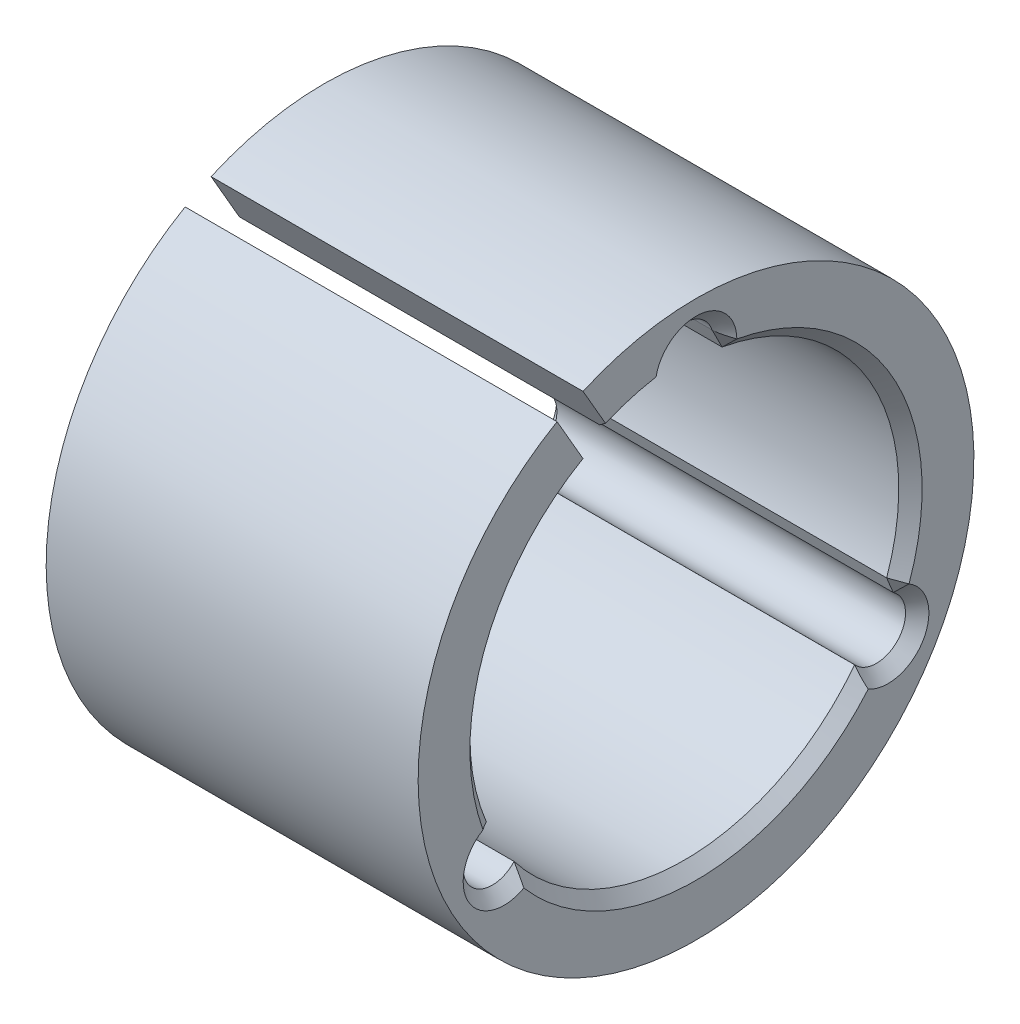
ISO-10303-21;
HEADER;
FILE_DESCRIPTION(('STEP AP214'),'2;1');
FILE_NAME('part.step','',(''),(''),'','','');
FILE_SCHEMA(('AUTOMOTIVE_DESIGN { 1 0 10303 214 1 1 1 1 }'));
ENDSEC;
DATA;
#1=APPLICATION_CONTEXT('core data for automotive mechanical design processes');
#2=APPLICATION_PROTOCOL_DEFINITION('international standard','automotive_design',2000,#1);
#3=PRODUCT_CONTEXT('',#1,'mechanical');
#4=PRODUCT('Part','Part','',(#3));
#5=PRODUCT_RELATED_PRODUCT_CATEGORY('part','',(#4));
#6=PRODUCT_DEFINITION_FORMATION('','',#4);
#7=PRODUCT_DEFINITION_CONTEXT('part definition',#1,'design');
#8=PRODUCT_DEFINITION('design','',#6,#7);
#9=PRODUCT_DEFINITION_SHAPE('','',#8);
#10=(LENGTH_UNIT() NAMED_UNIT(*) SI_UNIT(.MILLI.,.METRE.));
#11=(NAMED_UNIT(*) PLANE_ANGLE_UNIT() SI_UNIT($,.RADIAN.));
#12=(NAMED_UNIT(*) SI_UNIT($,.STERADIAN.) SOLID_ANGLE_UNIT());
#13=UNCERTAINTY_MEASURE_WITH_UNIT(LENGTH_MEASURE(1.E-05),#10,'distance_accuracy_value','');
#14=(GEOMETRIC_REPRESENTATION_CONTEXT(3) GLOBAL_UNCERTAINTY_ASSIGNED_CONTEXT((#13)) GLOBAL_UNIT_ASSIGNED_CONTEXT((#10,
#11,#12)) REPRESENTATION_CONTEXT('',''));
#15=CARTESIAN_POINT('',(0.,0.,0.));
#16=DIRECTION('',(0.,0.,1.));
#17=DIRECTION('',(1.,0.,0.));
#18=AXIS2_PLACEMENT_3D('',#15,#16,#17);
#19=CARTESIAN_POINT('',(12.75,-3.79999999999994,6.58179306876177));
#20=DIRECTION('',(-1.,0.,0.));
#21=DIRECTION('',(0.,0.,1.));
#22=AXIS2_PLACEMENT_3D('',#19,#20,#21);
#23=CYLINDRICAL_SURFACE('',#22,1.);
#24=DIRECTION('',(-1.,0.,0.));
#25=VECTOR('',#24,1.);
#26=CARTESIAN_POINT('',(12.75,-2.82127432049224,6.78696627430335));
#27=LINE('',#26,#25);
#28=CARTESIAN_POINT('',(12.35,-2.82127432049224,6.78696627430335));
#29=VERTEX_POINT('',#28);
#30=CARTESIAN_POINT('',(0.399999999999996,-2.82127432049224,6.78696627430335));
#31=VERTEX_POINT('',#30);
#32=EDGE_CURVE('E255',#29,#31,#27,.T.);
#33=ORIENTED_EDGE('',*,*,#32,.F.);
#34=CARTESIAN_POINT('',(12.35,-3.79999999999994,6.58179306876177));
#35=DIRECTION('',(1.,0.,0.));
#36=DIRECTION('',(0.,0.,-1.));
#37=AXIS2_PLACEMENT_3D('',#34,#35,#36);
#38=CIRCLE('',#37,1.);
#39=CARTESIAN_POINT('',(12.35,-4.46704804792869,5.83677836974272));
#40=VERTEX_POINT('',#39);
#41=EDGE_CURVE('E324',#29,#40,#38,.T.);
#42=ORIENTED_EDGE('',*,*,#41,.T.);
#43=DIRECTION('',(-1.,0.,0.));
#44=VECTOR('',#43,1.);
#45=CARTESIAN_POINT('',(12.75,-4.46704804792869,5.83677836974272));
#46=LINE('',#45,#44);
#47=CARTESIAN_POINT('',(0.399999999999996,-4.46704804792869,5.83677836974272));
#48=VERTEX_POINT('',#47);
#49=EDGE_CURVE('E227',#40,#48,#46,.T.);
#50=ORIENTED_EDGE('',*,*,#49,.T.);
#51=CARTESIAN_POINT('',(0.399999999999996,-3.79999999999994,6.58179306876177));
#52=DIRECTION('',(1.,0.,0.));
#53=DIRECTION('',(0.,0.,-1.));
#54=AXIS2_PLACEMENT_3D('',#51,#52,#53);
#55=CIRCLE('',#54,1.);
#56=EDGE_CURVE('E325',#48,#31,#55,.F.);
#57=ORIENTED_EDGE('',*,*,#56,.T.);
#58=EDGE_LOOP('',(#33,#42,#50,#57));
#59=FACE_BOUND('',#58,.T.);
#60=ADVANCED_FACE('F47',(#59),#23,.F.);
#61=CARTESIAN_POINT('',(12.75,0.,0.));
#62=DIRECTION('',(-1.,0.,0.));
#63=DIRECTION('',(0.,0.,1.));
#64=AXIS2_PLACEMENT_3D('',#61,#62,#63);
#65=CYLINDRICAL_SURFACE('',#64,7.35);
#66=DIRECTION('',(-1.,0.,0.));
#67=VECTOR('',#66,1.);
#68=CARTESIAN_POINT('',(12.75,6.36528671781562,3.67500000000001));
#69=LINE('',#68,#67);
#70=CARTESIAN_POINT('',(12.35,6.36528671781562,3.67500000000001));
#71=VERTEX_POINT('',#70);
#72=CARTESIAN_POINT('',(0.399999999999996,6.36528671781562,3.67500000000001));
#73=VERTEX_POINT('',#72);
#74=EDGE_CURVE('E203',#71,#73,#69,.T.);
#75=ORIENTED_EDGE('',*,*,#74,.F.);
#76=CARTESIAN_POINT('',(12.35,0.,0.));
#77=DIRECTION('',(1.,0.,0.));
#78=DIRECTION('',(0.,0.,-1.));
#79=AXIS2_PLACEMENT_3D('',#76,#77,#78);
#80=CIRCLE('',#79,7.35);
#81=EDGE_CURVE('E291',#71,#29,#80,.T.);
#82=ORIENTED_EDGE('',*,*,#81,.T.);
#83=ORIENTED_EDGE('',*,*,#32,.T.);
#84=CARTESIAN_POINT('',(0.399999999999996,0.,0.));
#85=DIRECTION('',(1.,0.,0.));
#86=DIRECTION('',(0.,0.,-1.));
#87=AXIS2_PLACEMENT_3D('',#84,#85,#86);
#88=CIRCLE('',#87,7.35);
#89=EDGE_CURVE('E288',#31,#73,#88,.F.);
#90=ORIENTED_EDGE('',*,*,#89,.T.);
#91=EDGE_LOOP('',(#75,#82,#83,#90));
#92=FACE_BOUND('',#91,.T.);
#93=ADVANCED_FACE('F555',(#92),#65,.F.);
#94=CARTESIAN_POINT('',(12.75,0.,0.));
#95=DIRECTION('',(0.,0.500000000000001,-0.866025403784438));
#96=DIRECTION('',(0.,0.866025403784438,0.500000000000001));
#97=AXIS2_PLACEMENT_3D('',#94,#95,#96);
#98=PLANE('',#97);
#99=DIRECTION('',(0.,-0.866025403784438,-0.500000000000001));
#100=VECTOR('',#99,1.);
#101=CARTESIAN_POINT('',(12.75,0.,0.));
#102=LINE('',#101,#100);
#103=CARTESIAN_POINT('',(12.75,8.24889197104677,4.76250000000001));
#104=VERTEX_POINT('',#103);
#105=CARTESIAN_POINT('',(12.75,6.71169687932939,3.87500000000001));
#106=VERTEX_POINT('',#105);
#107=EDGE_CURVE('E191',#104,#106,#102,.T.);
#108=ORIENTED_EDGE('',*,*,#107,.T.);
#109=DIRECTION('',(0.707106781186546,0.612372435695796,0.353553390593275));
#110=VECTOR('',#109,1.);
#111=CARTESIAN_POINT('',(5.00000000000004,0.,0.));
#112=LINE('',#111,#110);
#113=EDGE_CURVE('E317',#106,#71,#112,.F.);
#114=ORIENTED_EDGE('',*,*,#113,.T.);
#115=ORIENTED_EDGE('',*,*,#74,.T.);
#116=DIRECTION('',(0.70710678118655,-0.612372435695792,-0.353553390593273));
#117=VECTOR('',#116,1.);
#118=CARTESIAN_POINT('',(7.75000000000004,0.,0.));
#119=LINE('',#118,#117);
#120=CARTESIAN_POINT('',(0.,6.71169687932939,3.87500000000001));
#121=VERTEX_POINT('',#120);
#122=EDGE_CURVE('E316',#73,#121,#119,.F.);
#123=ORIENTED_EDGE('',*,*,#122,.T.);
#124=DIRECTION('',(0.,-0.866025403784438,-0.500000000000001));
#125=VECTOR('',#124,1.);
#126=CARTESIAN_POINT('',(0.,0.,0.));
#127=LINE('',#126,#125);
#128=CARTESIAN_POINT('',(0.,8.24889197104677,4.76250000000001));
#129=VERTEX_POINT('',#128);
#130=EDGE_CURVE('E198',#129,#121,#127,.T.);
#131=ORIENTED_EDGE('',*,*,#130,.F.);
#132=DIRECTION('',(-1.,0.,0.));
#133=VECTOR('',#132,1.);
#134=CARTESIAN_POINT('',(12.75,8.24889197104677,4.76250000000001));
#135=LINE('',#134,#133);
#136=EDGE_CURVE('E186',#104,#129,#135,.T.);
#137=ORIENTED_EDGE('',*,*,#136,.F.);
#138=EDGE_LOOP('',(#108,#114,#115,#123,#131,#137));
#139=FACE_BOUND('',#138,.T.);
#140=ADVANCED_FACE('F194',(#139),#98,.T.);
#141=CARTESIAN_POINT('',(12.75,0.,0.));
#142=DIRECTION('',(-1.,0.,0.));
#143=DIRECTION('',(0.,0.,1.));
#144=AXIS2_PLACEMENT_3D('',#141,#142,#143);
#145=CYLINDRICAL_SURFACE('',#144,9.525);
#146=CARTESIAN_POINT('',(0.,0.,0.));
#147=DIRECTION('',(1.,0.,0.));
#148=DIRECTION('',(0.,0.,-1.));
#149=AXIS2_PLACEMENT_3D('',#146,#147,#148);
#150=CIRCLE('',#149,9.525);
#151=CARTESIAN_POINT('',(0.,8.70274195443803,3.87142189311165));
#152=VERTEX_POINT('',#151);
#153=EDGE_CURVE('E229',#129,#152,#150,.T.);
#154=ORIENTED_EDGE('',*,*,#153,.T.);
#155=DIRECTION('',(-1.,0.,0.));
#156=VECTOR('',#155,1.);
#157=CARTESIAN_POINT('',(12.75,8.70274195443803,3.87142189311165));
#158=LINE('',#157,#156);
#159=CARTESIAN_POINT('',(12.75,8.70274195443803,3.87142189311165));
#160=VERTEX_POINT('',#159);
#161=EDGE_CURVE('E205',#160,#152,#158,.T.);
#162=ORIENTED_EDGE('',*,*,#161,.F.);
#163=CARTESIAN_POINT('',(12.75,0.,0.));
#164=DIRECTION('',(1.,0.,0.));
#165=DIRECTION('',(0.,0.,-1.));
#166=AXIS2_PLACEMENT_3D('',#163,#164,#165);
#167=CIRCLE('',#166,9.525);
#168=EDGE_CURVE('E206',#104,#160,#167,.T.);
#169=ORIENTED_EDGE('',*,*,#168,.F.);
#170=ORIENTED_EDGE('',*,*,#136,.T.);
#171=EDGE_LOOP('',(#154,#162,#169,#170));
#172=FACE_BOUND('',#171,.T.);
#173=ADVANCED_FACE('F210',(#172),#145,.T.);
#174=CARTESIAN_POINT('',(12.75,0.499310634508551,-0.864831387728262));
#175=DIRECTION('',(0.,-0.500000000000001,0.866025403784438));
#176=DIRECTION('',(0.,-0.866025403784438,-0.500000000000001));
#177=AXIS2_PLACEMENT_3D('',#174,#175,#176);
#178=PLANE('',#177);
#179=DIRECTION('',(-1.,0.,0.));
#180=VECTOR('',#179,1.);
#181=CARTESIAN_POINT('',(12.75,7.0240379599069,2.9022216899794));
#182=LINE('',#181,#180);
#183=CARTESIAN_POINT('',(12.35,7.0240379599069,2.9022216899794));
#184=VERTEX_POINT('',#183);
#185=CARTESIAN_POINT('',(0.,7.0240379599069,2.9022216899794));
#186=VERTEX_POINT('',#185);
#187=EDGE_CURVE('E247',#184,#186,#182,.T.);
#188=ORIENTED_EDGE('',*,*,#187,.F.);
#189=CARTESIAN_POINT('',(12.35,7.0240379599069,2.9022216899794));
#190=CARTESIAN_POINT('',(12.4166522960563,7.08226472669563,2.93583892945891));
#191=CARTESIAN_POINT('',(12.4833117774276,7.14048532206287,2.96945260586656));
#192=CARTESIAN_POINT('',(12.616645110761,7.25691416992027,3.03667283251847));
#193=CARTESIAN_POINT('',(12.683318962723,7.31512242241044,3.07027938276273));
#194=CARTESIAN_POINT('',(12.75,7.37332450347913,3.10388236993514));
#195=B_SPLINE_CURVE_WITH_KNOTS('',3,(#189,#190,#191,#192,#193,#194),.UNSPECIFIED.,.F.,.F.,(4,2,
4),(0.,0.284019419774727,0.568038839383033),.UNSPECIFIED.);
#196=CARTESIAN_POINT('',(12.75,7.37332450347913,3.10388236993514));
#197=VERTEX_POINT('',#196);
#198=EDGE_CURVE('E613',#184,#197,#195,.T.);
#199=ORIENTED_EDGE('',*,*,#198,.T.);
#200=DIRECTION('',(0.,0.866025403784438,0.500000000000001));
#201=VECTOR('',#200,1.);
#202=CARTESIAN_POINT('',(12.75,0.499310634508551,-0.864831387728262));
#203=LINE('',#202,#201);
#204=EDGE_CURVE('E211',#197,#160,#203,.T.);
#205=ORIENTED_EDGE('',*,*,#204,.T.);
#206=ORIENTED_EDGE('',*,*,#161,.T.);
#207=DIRECTION('',(0.,0.866025403784438,0.500000000000001));
#208=VECTOR('',#207,1.);
#209=CARTESIAN_POINT('',(0.,0.499310634508551,-0.864831387728262));
#210=LINE('',#209,#208);
#211=EDGE_CURVE('E222',#186,#152,#210,.T.);
#212=ORIENTED_EDGE('',*,*,#211,.F.);
#213=EDGE_LOOP('',(#188,#199,#205,#206,#212));
#214=FACE_BOUND('',#213,.T.);
#215=ADVANCED_FACE('F616',(#214),#178,.T.);
#216=CARTESIAN_POINT('',(12.75,0.,0.));
#217=DIRECTION('',(-1.,0.,0.));
#218=DIRECTION('',(0.,0.,1.));
#219=AXIS2_PLACEMENT_3D('',#216,#217,#218);
#220=CYLINDRICAL_SURFACE('',#219,7.6);
#221=DIRECTION('',(-1.,0.,0.));
#222=VECTOR('',#221,1.);
#223=CARTESIAN_POINT('',(12.75,7.53421052631579,0.997833525770888));
#224=LINE('',#223,#222);
#225=CARTESIAN_POINT('',(12.35,7.53421052631579,0.997833525770888));
#226=VERTEX_POINT('',#225);
#227=CARTESIAN_POINT('',(0.399999999999996,7.53421052631579,0.997833525770888));
#228=VERTEX_POINT('',#227);
#229=EDGE_CURVE('E245',#226,#228,#224,.T.);
#230=ORIENTED_EDGE('',*,*,#229,.F.);
#231=CARTESIAN_POINT('',(12.35,0.,0.));
#232=DIRECTION('',(1.,0.,0.));
#233=DIRECTION('',(0.,0.,-1.));
#234=AXIS2_PLACEMENT_3D('',#231,#232,#233);
#235=CIRCLE('',#234,7.6);
#236=EDGE_CURVE('E345',#226,#184,#235,.T.);
#237=ORIENTED_EDGE('',*,*,#236,.T.);
#238=ORIENTED_EDGE('',*,*,#187,.T.);
#239=CARTESIAN_POINT('',(0.,0.,0.));
#240=DIRECTION('',(1.,0.,0.));
#241=DIRECTION('',(0.,0.,-1.));
#242=AXIS2_PLACEMENT_3D('',#239,#240,#241);
#243=CIRCLE('',#242,7.6);
#244=CARTESIAN_POINT('',(0.,7.47105263157895,1.39404898629039));
#245=VERTEX_POINT('',#244);
#246=EDGE_CURVE('E220',#245,#186,#243,.T.);
#247=ORIENTED_EDGE('',*,*,#246,.F.);
#248=CARTESIAN_POINT('',(0.,7.47105263157895,1.39404898629039));
#249=CARTESIAN_POINT('',(0.0666317121295569,7.48332781409374,1.32825656081401));
#250=CARTESIAN_POINT('',(0.133280901875942,7.4947285632917,1.26234239268646));
#251=CARTESIAN_POINT('',(0.266614235210004,7.51578119483412,1.1302705725082));
#252=CARTESIAN_POINT('',(0.333298378796951,7.52543307721511,1.06411292046259));
#253=CARTESIAN_POINT('',(0.399999999999996,7.53421052631579,0.997833525770885));
#254=B_SPLINE_CURVE_WITH_KNOTS('',3,(#248,#249,#250,#251,#252,#253),.UNSPECIFIED.,.F.,.F.,(4,2,
4),(0.,0.283285937216528,0.56657186851649),.UNSPECIFIED.);
#255=EDGE_CURVE('E331',#245,#228,#254,.T.);
#256=ORIENTED_EDGE('',*,*,#255,.T.);
#257=EDGE_LOOP('',(#230,#237,#238,#247,#256));
#258=FACE_BOUND('',#257,.T.);
#259=ADVANCED_FACE('F343',(#258),#220,.F.);
#260=CARTESIAN_POINT('',(12.75,7.6,0.));
#261=DIRECTION('',(-1.,0.,0.));
#262=DIRECTION('',(0.,0.,1.));
#263=AXIS2_PLACEMENT_3D('',#260,#261,#262);
#264=CYLINDRICAL_SURFACE('',#263,1.);
#265=DIRECTION('',(-1.,0.,0.));
#266=VECTOR('',#265,1.);
#267=CARTESIAN_POINT('',(12.75,7.92077063747412,-0.947156902595578));
#268=LINE('',#267,#266);
#269=CARTESIAN_POINT('',(0.399999999999996,7.92077063747412,-0.947156902595577));
#270=VERTEX_POINT('',#269);
#271=CARTESIAN_POINT('',(12.35,7.92077063747412,-0.947156902595577));
#272=VERTEX_POINT('',#271);
#273=EDGE_CURVE('E273',#270,#272,#268,.F.);
#274=ORIENTED_EDGE('',*,*,#273,.T.);
#275=CARTESIAN_POINT('',(12.35,7.6,0.));
#276=DIRECTION('',(1.,0.,0.));
#277=DIRECTION('',(0.,0.,-1.));
#278=AXIS2_PLACEMENT_3D('',#275,#276,#277);
#279=CIRCLE('',#278,1.);
#280=EDGE_CURVE('E279',#272,#226,#279,.T.);
#281=ORIENTED_EDGE('',*,*,#280,.T.);
#282=ORIENTED_EDGE('',*,*,#229,.T.);
#283=CARTESIAN_POINT('',(0.399999999999996,7.6,0.));
#284=DIRECTION('',(1.,0.,0.));
#285=DIRECTION('',(0.,0.,-1.));
#286=AXIS2_PLACEMENT_3D('',#283,#284,#285);
#287=CIRCLE('',#286,1.);
#288=EDGE_CURVE('E271',#228,#270,#287,.F.);
#289=ORIENTED_EDGE('',*,*,#288,.T.);
#290=EDGE_LOOP('',(#274,#281,#282,#289));
#291=FACE_BOUND('',#290,.T.);
#292=ADVANCED_FACE('F591',(#291),#264,.F.);
#293=CARTESIAN_POINT('',(12.75,0.,0.));
#294=DIRECTION('',(-1.,0.,0.));
#295=DIRECTION('',(0.,0.,1.));
#296=AXIS2_PLACEMENT_3D('',#293,#294,#295);
#297=CYLINDRICAL_SURFACE('',#296,7.35);
#298=DIRECTION('',(-1.,0.,0.));
#299=VECTOR('',#298,1.);
#300=CARTESIAN_POINT('',(12.75,-2.43684319827992,-6.93428404573946));
#301=LINE('',#300,#299);
#302=CARTESIAN_POINT('',(0.399999999999996,-2.43684319827992,-6.93428404573947));
#303=VERTEX_POINT('',#302);
#304=CARTESIAN_POINT('',(12.35,-2.43684319827992,-6.93428404573947));
#305=VERTEX_POINT('',#304);
#306=EDGE_CURVE('E261',#303,#305,#301,.F.);
#307=ORIENTED_EDGE('',*,*,#306,.T.);
#308=CARTESIAN_POINT('',(12.35,0.,0.));
#309=DIRECTION('',(1.,0.,0.));
#310=DIRECTION('',(0.,0.,-1.));
#311=AXIS2_PLACEMENT_3D('',#308,#309,#310);
#312=CIRCLE('',#311,7.35);
#313=CARTESIAN_POINT('',(12.35,7.23518420095203,-1.2940670687001));
#314=VERTEX_POINT('',#313);
#315=EDGE_CURVE('E268',#305,#314,#312,.T.);
#316=ORIENTED_EDGE('',*,*,#315,.T.);
#317=DIRECTION('',(-1.,0.,0.));
#318=VECTOR('',#317,1.);
#319=CARTESIAN_POINT('',(12.75,7.23518420095203,-1.2940670687001));
#320=LINE('',#319,#318);
#321=CARTESIAN_POINT('',(0.399999999999996,7.23518420095203,-1.2940670687001));
#322=VERTEX_POINT('',#321);
#323=EDGE_CURVE('E262',#314,#322,#320,.T.);
#324=ORIENTED_EDGE('',*,*,#323,.T.);
#325=CARTESIAN_POINT('',(0.399999999999996,0.,0.));
#326=DIRECTION('',(1.,0.,0.));
#327=DIRECTION('',(0.,0.,-1.));
#328=AXIS2_PLACEMENT_3D('',#325,#326,#327);
#329=CIRCLE('',#328,7.35);
#330=EDGE_CURVE('E256',#322,#303,#329,.F.);
#331=ORIENTED_EDGE('',*,*,#330,.T.);
#332=EDGE_LOOP('',(#307,#316,#324,#331));
#333=FACE_BOUND('',#332,.T.);
#334=ADVANCED_FACE('F647',(#333),#297,.F.);
#335=CARTESIAN_POINT('',(12.75,-3.80000000000003,-6.58179306876172));
#336=DIRECTION('',(-1.,0.,0.));
#337=DIRECTION('',(0.,0.,1.));
#338=AXIS2_PLACEMENT_3D('',#335,#336,#337);
#339=CYLINDRICAL_SURFACE('',#338,1.);
#340=DIRECTION('',(-1.,0.,0.));
#341=VECTOR('',#340,1.);
#342=CARTESIAN_POINT('',(12.75,-4.46704804792877,-5.83677836974266));
#343=LINE('',#342,#341);
#344=CARTESIAN_POINT('',(12.35,-4.46704804792877,-5.83677836974266));
#345=VERTEX_POINT('',#344);
#346=CARTESIAN_POINT('',(0.399999999999996,-4.46704804792877,-5.83677836974266));
#347=VERTEX_POINT('',#346);
#348=EDGE_CURVE('E236',#345,#347,#343,.T.);
#349=ORIENTED_EDGE('',*,*,#348,.F.);
#350=CARTESIAN_POINT('',(12.35,-3.80000000000003,-6.58179306876172));
#351=DIRECTION('',(1.,0.,0.));
#352=DIRECTION('',(0.,0.,-1.));
#353=AXIS2_PLACEMENT_3D('',#350,#351,#352);
#354=CIRCLE('',#353,1.);
#355=CARTESIAN_POINT('',(12.35,-2.98427231044547,-7.16022918147771));
#356=VERTEX_POINT('',#355);
#357=EDGE_CURVE('E289',#345,#356,#354,.T.);
#358=ORIENTED_EDGE('',*,*,#357,.T.);
#359=DIRECTION('',(-1.,0.,0.));
#360=VECTOR('',#359,1.);
#361=CARTESIAN_POINT('',(12.75,-2.98427231044547,-7.16022918147771));
#362=LINE('',#361,#360);
#363=CARTESIAN_POINT('',(0.399999999999996,-2.98427231044547,-7.16022918147771));
#364=VERTEX_POINT('',#363);
#365=EDGE_CURVE('E284',#356,#364,#362,.T.);
#366=ORIENTED_EDGE('',*,*,#365,.T.);
#367=CARTESIAN_POINT('',(0.399999999999996,-3.80000000000003,-6.58179306876172));
#368=DIRECTION('',(1.,0.,0.));
#369=DIRECTION('',(0.,0.,-1.));
#370=AXIS2_PLACEMENT_3D('',#367,#368,#369);
#371=CIRCLE('',#370,1.);
#372=EDGE_CURVE('E282',#364,#347,#371,.F.);
#373=ORIENTED_EDGE('',*,*,#372,.T.);
#374=EDGE_LOOP('',(#349,#358,#366,#373));
#375=FACE_BOUND('',#374,.T.);
#376=ADVANCED_FACE('F656',(#375),#339,.F.);
#377=CARTESIAN_POINT('',(12.75,0.,0.));
#378=DIRECTION('',(-1.,0.,0.));
#379=DIRECTION('',(0.,0.,1.));
#380=AXIS2_PLACEMENT_3D('',#377,#378,#379);
#381=CYLINDRICAL_SURFACE('',#380,7.35);
#382=ORIENTED_EDGE('',*,*,#49,.F.);
#383=CARTESIAN_POINT('',(12.35,0.,0.));
#384=DIRECTION('',(1.,0.,0.));
#385=DIRECTION('',(0.,0.,-1.));
#386=AXIS2_PLACEMENT_3D('',#383,#384,#385);
#387=CIRCLE('',#386,7.35);
#388=EDGE_CURVE('E332',#40,#345,#387,.T.);
#389=ORIENTED_EDGE('',*,*,#388,.T.);
#390=ORIENTED_EDGE('',*,*,#348,.T.);
#391=CARTESIAN_POINT('',(0.399999999999996,0.,0.));
#392=DIRECTION('',(1.,0.,0.));
#393=DIRECTION('',(0.,0.,-1.));
#394=AXIS2_PLACEMENT_3D('',#391,#392,#393);
#395=CIRCLE('',#394,7.35);
#396=EDGE_CURVE('E327',#347,#48,#395,.F.);
#397=ORIENTED_EDGE('',*,*,#396,.T.);
#398=EDGE_LOOP('',(#382,#389,#390,#397));
#399=FACE_BOUND('',#398,.T.);
#400=ADVANCED_FACE('F663',(#399),#381,.F.);
#401=CARTESIAN_POINT('',(12.75,0.,0.));
#402=DIRECTION('',(1.,0.,0.));
#403=DIRECTION('',(0.,0.,-1.));
#404=AXIS2_PLACEMENT_3D('',#401,#402,#403);
#405=PLANE('',#404);
#406=CARTESIAN_POINT('',(12.75,-3.79999999999994,6.58179306876177));
#407=DIRECTION('',(1.,0.,0.));
#408=DIRECTION('',(0.,0.,-1.));
#409=AXIS2_PLACEMENT_3D('',#406,#407,#408);
#410=CIRCLE('',#409,1.4);
#411=CARTESIAN_POINT('',(12.75,-5.02354496383687,5.90139780020879));
#412=VERTEX_POINT('',#411);
#413=CARTESIAN_POINT('',(12.75,-2.59898793089985,7.30121645584055));
#414=VERTEX_POINT('',#413);
#415=EDGE_CURVE('E313',#412,#414,#410,.F.);
#416=ORIENTED_EDGE('',*,*,#415,.T.);
#417=CARTESIAN_POINT('',(12.75,0.,0.));
#418=DIRECTION('',(1.,0.,0.));
#419=DIRECTION('',(0.,0.,-1.));
#420=AXIS2_PLACEMENT_3D('',#417,#418,#419);
#421=CIRCLE('',#420,7.75);
#422=EDGE_CURVE('E214',#414,#106,#421,.F.);
#423=ORIENTED_EDGE('',*,*,#422,.T.);
#424=ORIENTED_EDGE('',*,*,#107,.F.);
#425=ORIENTED_EDGE('',*,*,#168,.T.);
#426=ORIENTED_EDGE('',*,*,#204,.F.);
#427=CARTESIAN_POINT('',(12.75,0.,0.));
#428=DIRECTION('',(1.,0.,0.));
#429=DIRECTION('',(0.,0.,-1.));
#430=AXIS2_PLACEMENT_3D('',#427,#428,#429);
#431=CIRCLE('',#430,7.99999999999999);
#432=CARTESIAN_POINT('',(12.75,7.88157894736842,1.37139100784528));
#433=VERTEX_POINT('',#432);
#434=EDGE_CURVE('E297',#197,#433,#431,.F.);
#435=ORIENTED_EDGE('',*,*,#434,.T.);
#436=CARTESIAN_POINT('',(12.75,7.6,0.));
#437=DIRECTION('',(1.,0.,0.));
#438=DIRECTION('',(0.,0.,-1.));
#439=AXIS2_PLACEMENT_3D('',#436,#437,#438);
#440=CIRCLE('',#439,1.4);
#441=CARTESIAN_POINT('',(12.75,7.62253289473684,-1.39981865563178));
#442=VERTEX_POINT('',#441);
#443=EDGE_CURVE('E299',#433,#442,#440,.F.);
#444=ORIENTED_EDGE('',*,*,#443,.T.);
#445=CARTESIAN_POINT('',(12.75,0.,0.));
#446=DIRECTION('',(1.,0.,0.));
#447=DIRECTION('',(0.,0.,-1.));
#448=AXIS2_PLACEMENT_3D('',#445,#446,#447);
#449=CIRCLE('',#448,7.75);
#450=CARTESIAN_POINT('',(12.75,-2.59898793089995,-7.30121645584051));
#451=VERTEX_POINT('',#450);
#452=EDGE_CURVE('E304',#442,#451,#449,.F.);
#453=ORIENTED_EDGE('',*,*,#452,.T.);
#454=CARTESIAN_POINT('',(12.75,-3.80000000000003,-6.58179306876172));
#455=DIRECTION('',(1.,0.,0.));
#456=DIRECTION('',(0.,0.,-1.));
#457=AXIS2_PLACEMENT_3D('',#454,#455,#456);
#458=CIRCLE('',#457,1.4);
#459=CARTESIAN_POINT('',(12.75,-5.02354496383695,-5.90139780020872));
#460=VERTEX_POINT('',#459);
#461=EDGE_CURVE('E303',#451,#460,#458,.F.);
#462=ORIENTED_EDGE('',*,*,#461,.T.);
#463=CARTESIAN_POINT('',(12.75,0.,0.));
#464=DIRECTION('',(1.,0.,0.));
#465=DIRECTION('',(0.,0.,-1.));
#466=AXIS2_PLACEMENT_3D('',#463,#464,#465);
#467=CIRCLE('',#466,7.75);
#468=EDGE_CURVE('E306',#460,#412,#467,.F.);
#469=ORIENTED_EDGE('',*,*,#468,.T.);
#470=EDGE_LOOP('',(#416,#423,#424,#425,#426,#435,#444,#453,#462,#469));
#471=FACE_BOUND('',#470,.T.);
#472=ADVANCED_FACE('F213',(#471),#405,.T.);
#473=CARTESIAN_POINT('',(0.,0.,0.));
#474=DIRECTION('',(1.,0.,0.));
#475=DIRECTION('',(0.,0.,-1.));
#476=AXIS2_PLACEMENT_3D('',#473,#474,#475);
#477=PLANE('',#476);
#478=ORIENTED_EDGE('',*,*,#130,.T.);
#479=CARTESIAN_POINT('',(0.,0.,0.));
#480=DIRECTION('',(1.,0.,0.));
#481=DIRECTION('',(0.,0.,-1.));
#482=AXIS2_PLACEMENT_3D('',#479,#480,#481);
#483=CIRCLE('',#482,7.74999999999999);
#484=CARTESIAN_POINT('',(0.,-2.59898793089985,7.30121645584055));
#485=VERTEX_POINT('',#484);
#486=EDGE_CURVE('E11',#121,#485,#483,.T.);
#487=ORIENTED_EDGE('',*,*,#486,.T.);
#488=CARTESIAN_POINT('',(0.,-3.79999999999994,6.58179306876177));
#489=DIRECTION('',(1.,0.,0.));
#490=DIRECTION('',(0.,0.,-1.));
#491=AXIS2_PLACEMENT_3D('',#488,#489,#490);
#492=CIRCLE('',#491,1.39999999999999);
#493=CARTESIAN_POINT('',(0.,-5.02354496383686,5.90139780020879));
#494=VERTEX_POINT('',#493);
#495=EDGE_CURVE('E67',#485,#494,#492,.T.);
#496=ORIENTED_EDGE('',*,*,#495,.T.);
#497=CARTESIAN_POINT('',(0.,0.,0.));
#498=DIRECTION('',(1.,0.,0.));
#499=DIRECTION('',(0.,0.,-1.));
#500=AXIS2_PLACEMENT_3D('',#497,#498,#499);
#501=CIRCLE('',#500,7.74999999999999);
#502=CARTESIAN_POINT('',(0.,-5.02354496383695,-5.90139780020872));
#503=VERTEX_POINT('',#502);
#504=EDGE_CURVE('E602',#494,#503,#501,.T.);
#505=ORIENTED_EDGE('',*,*,#504,.T.);
#506=CARTESIAN_POINT('',(0.,-3.80000000000003,-6.58179306876172));
#507=DIRECTION('',(1.,0.,0.));
#508=DIRECTION('',(0.,0.,-1.));
#509=AXIS2_PLACEMENT_3D('',#506,#507,#508);
#510=CIRCLE('',#509,1.39999999999999);
#511=CARTESIAN_POINT('',(0.,-2.59898793089995,-7.30121645584051));
#512=VERTEX_POINT('',#511);
#513=EDGE_CURVE('E607',#503,#512,#510,.T.);
#514=ORIENTED_EDGE('',*,*,#513,.T.);
#515=CARTESIAN_POINT('',(0.,0.,0.));
#516=DIRECTION('',(1.,0.,0.));
#517=DIRECTION('',(0.,0.,-1.));
#518=AXIS2_PLACEMENT_3D('',#515,#516,#517);
#519=CIRCLE('',#518,7.74999999999999);
#520=CARTESIAN_POINT('',(0.,7.62253289473684,-1.39981865563178));
#521=VERTEX_POINT('',#520);
#522=EDGE_CURVE('E606',#512,#521,#519,.T.);
#523=ORIENTED_EDGE('',*,*,#522,.T.);
#524=CARTESIAN_POINT('',(0.,7.6,0.));
#525=DIRECTION('',(1.,0.,0.));
#526=DIRECTION('',(0.,0.,-1.));
#527=AXIS2_PLACEMENT_3D('',#524,#525,#526);
#528=CIRCLE('',#527,1.39999999999999);
#529=EDGE_CURVE('E596',#521,#245,#528,.T.);
#530=ORIENTED_EDGE('',*,*,#529,.T.);
#531=ORIENTED_EDGE('',*,*,#246,.T.);
#532=ORIENTED_EDGE('',*,*,#211,.T.);
#533=ORIENTED_EDGE('',*,*,#153,.F.);
#534=EDGE_LOOP('',(#478,#487,#496,#505,#514,#523,#530,#531,#532,#533));
#535=FACE_BOUND('',#534,.T.);
#536=ADVANCED_FACE('F547',(#535),#477,.F.);
#537=CARTESIAN_POINT('',(12.35,0.,0.));
#538=DIRECTION('',(1.,0.,0.));
#539=DIRECTION('',(0.,0.,-1.));
#540=AXIS2_PLACEMENT_3D('',#537,#538,#539);
#541=CONICAL_SURFACE('',#540,7.35,0.78539816339745);
#542=ORIENTED_EDGE('',*,*,#113,.F.);
#543=ORIENTED_EDGE('',*,*,#422,.F.);
#544=CARTESIAN_POINT('',(12.35,-2.82127432049224,6.78696627430335));
#545=CARTESIAN_POINT('',(12.3809277638869,-2.79869735873939,6.82983966038442));
#546=CARTESIAN_POINT('',(12.4126572508062,-2.7773736614635,6.87276296238352));
#547=CARTESIAN_POINT('',(12.4773749432949,-2.73687932510569,6.95858088761474));
#548=CARTESIAN_POINT('',(12.5103614578121,-2.71770592137262,7.00147547552115));
#549=CARTESIAN_POINT('',(12.5773109869629,-2.68111261655947,7.08719437651109));
#550=CARTESIAN_POINT('',(12.6112734208567,-2.66369169931457,7.13001871599001));
#551=CARTESIAN_POINT('',(12.6800522891193,-2.63030572988747,7.21565077573461));
#552=CARTESIAN_POINT('',(12.71486977259,-2.61434259251498,7.25845840263975));
#553=CARTESIAN_POINT('',(12.75,-2.59898793089985,7.30121645584055));
#554=B_SPLINE_CURVE_WITH_KNOTS('',3,(#544,#545,#546,#547,#548,#549,#550,#551,#552,#553),
.UNSPECIFIED.,.F.,.F.,(4,2,2,2,4),(0.,0.172397881871036,0.344571505744794,0.516644713646749,
0.688940784914335),.UNSPECIFIED.);
#555=EDGE_CURVE('E54',#29,#414,#554,.T.);
#556=ORIENTED_EDGE('',*,*,#555,.F.);
#557=ORIENTED_EDGE('',*,*,#81,.F.);
#558=EDGE_LOOP('',(#542,#543,#556,#557));
#559=FACE_BOUND('',#558,.T.);
#560=ADVANCED_FACE('F55',(#559),#541,.F.);
#561=CARTESIAN_POINT('',(0.,0.,0.));
#562=DIRECTION('',(-1.,0.,0.));
#563=DIRECTION('',(0.,0.,1.));
#564=AXIS2_PLACEMENT_3D('',#561,#562,#563);
#565=CONICAL_SURFACE('',#564,7.74999999999999,0.785398163397445);
#566=ORIENTED_EDGE('',*,*,#122,.F.);
#567=ORIENTED_EDGE('',*,*,#89,.F.);
#568=CARTESIAN_POINT('',(0.,-2.59898793089985,7.30121645584055));
#569=CARTESIAN_POINT('',(0.0351302274100157,-2.61434259251498,7.25845840263975));
#570=CARTESIAN_POINT('',(0.0699477108806955,-2.63030572988747,7.21565077573461));
#571=CARTESIAN_POINT('',(0.138726579143276,-2.66369169931457,7.13001871599001));
#572=CARTESIAN_POINT('',(0.17268901303709,-2.68111261655947,7.08719437651109));
#573=CARTESIAN_POINT('',(0.239638542187887,-2.71770592137262,7.00147547552114));
#574=CARTESIAN_POINT('',(0.272625056705122,-2.73687932510569,6.95858088761474));
#575=CARTESIAN_POINT('',(0.337342749193798,-2.7773736614635,6.87276296238352));
#576=CARTESIAN_POINT('',(0.369072236113133,-2.79869735873939,6.82983966038442));
#577=CARTESIAN_POINT('',(0.399999999999994,-2.82127432049225,6.78696627430334));
#578=B_SPLINE_CURVE_WITH_KNOTS('',3,(#568,#569,#570,#571,#572,#573,#574,#575,#576,#577),
.UNSPECIFIED.,.F.,.F.,(4,2,2,2,4),(0.,0.172296071267585,0.344369279169539,0.516542903043299,
0.688940784914333),.UNSPECIFIED.);
#579=EDGE_CURVE('E523',#485,#31,#578,.T.);
#580=ORIENTED_EDGE('',*,*,#579,.F.);
#581=ORIENTED_EDGE('',*,*,#486,.F.);
#582=EDGE_LOOP('',(#566,#567,#580,#581));
#583=FACE_BOUND('',#582,.T.);
#584=ADVANCED_FACE('F540',(#583),#565,.F.);
#585=CARTESIAN_POINT('',(12.35,-3.79999999999994,6.58179306876177));
#586=DIRECTION('',(1.,0.,0.));
#587=DIRECTION('',(0.,0.,-1.));
#588=AXIS2_PLACEMENT_3D('',#585,#586,#587);
#589=CONICAL_SURFACE('',#588,1.,0.78539816339745);
#590=ORIENTED_EDGE('',*,*,#555,.T.);
#591=ORIENTED_EDGE('',*,*,#415,.F.);
#592=CARTESIAN_POINT('',(12.35,-4.46704804792869,5.83677836974272));
#593=CARTESIAN_POINT('',(12.3809277638869,-4.51546597029759,5.83866284036502));
#594=CARTESIAN_POINT('',(12.4126572508062,-4.56330048888107,5.84165762782104));
#595=CARTESIAN_POINT('',(12.4773749432949,-4.65786816041028,5.84949746644139));
#596=CARTESIAN_POINT('',(12.5103614578121,-4.70460266508863,5.85434010568474));
#597=CARTESIAN_POINT('',(12.5773109869629,-4.79713406333698,5.86550882460311));
#598=CARTESIAN_POINT('',(12.6112734208567,-4.84293148784846,5.87183403745125));
#599=CARTESIAN_POINT('',(12.6800522891193,-4.93378401167923,5.88573696966971));
#600=CARTESIAN_POINT('',(12.71486977259,-4.97883807274104,5.89331630063361));
#601=CARTESIAN_POINT('',(12.75,-5.02354496383687,5.90139780020879));
#602=B_SPLINE_CURVE_WITH_KNOTS('',3,(#592,#593,#594,#595,#596,#597,#598,#599,#600,#601),
.UNSPECIFIED.,.F.,.F.,(4,2,2,2,4),(0.,0.172397881871036,0.344571505744795,0.516644713646748,
0.688940784914337),.UNSPECIFIED.);
#603=EDGE_CURVE('E518',#40,#412,#602,.T.);
#604=ORIENTED_EDGE('',*,*,#603,.F.);
#605=ORIENTED_EDGE('',*,*,#41,.F.);
#606=EDGE_LOOP('',(#590,#591,#604,#605));
#607=FACE_BOUND('',#606,.T.);
#608=ADVANCED_FACE('F533',(#607),#589,.F.);
#609=CARTESIAN_POINT('',(0.,-3.79999999999994,6.58179306876177));
#610=DIRECTION('',(-1.,0.,0.));
#611=DIRECTION('',(0.,0.,1.));
#612=AXIS2_PLACEMENT_3D('',#609,#610,#611);
#613=CONICAL_SURFACE('',#612,1.39999999999999,0.785398163397445);
#614=ORIENTED_EDGE('',*,*,#579,.T.);
#615=ORIENTED_EDGE('',*,*,#56,.F.);
#616=CARTESIAN_POINT('',(0.,-5.02354496383686,5.90139780020879));
#617=CARTESIAN_POINT('',(0.035130227410016,-4.97883807274104,5.89331630063361));
#618=CARTESIAN_POINT('',(0.0699477108806958,-4.93378401167922,5.88573696966971));
#619=CARTESIAN_POINT('',(0.138726579143276,-4.84293148784846,5.87183403745125));
#620=CARTESIAN_POINT('',(0.17268901303709,-4.79713406333697,5.8655088246031));
#621=CARTESIAN_POINT('',(0.239638542187887,-4.70460266508862,5.85434010568474));
#622=CARTESIAN_POINT('',(0.272625056705122,-4.65786816041028,5.84949746644139));
#623=CARTESIAN_POINT('',(0.337342749193798,-4.56330048888106,5.84165762782104));
#624=CARTESIAN_POINT('',(0.369072236113133,-4.51546597029759,5.83866284036502));
#625=CARTESIAN_POINT('',(0.399999999999994,-4.46704804792869,5.83677836974272));
#626=B_SPLINE_CURVE_WITH_KNOTS('',3,(#616,#617,#618,#619,#620,#621,#622,#623,#624,#625),
.UNSPECIFIED.,.F.,.F.,(4,2,2,2,4),(0.,0.172296071267584,0.344369279169539,0.516542903043299,
0.688940784914333),.UNSPECIFIED.);
#627=EDGE_CURVE('E496',#494,#48,#626,.T.);
#628=ORIENTED_EDGE('',*,*,#627,.F.);
#629=ORIENTED_EDGE('',*,*,#495,.F.);
#630=EDGE_LOOP('',(#614,#615,#628,#629));
#631=FACE_BOUND('',#630,.T.);
#632=ADVANCED_FACE('F514',(#631),#613,.F.);
#633=CARTESIAN_POINT('',(12.35,0.,0.));
#634=DIRECTION('',(1.,0.,0.));
#635=DIRECTION('',(0.,0.,-1.));
#636=AXIS2_PLACEMENT_3D('',#633,#634,#635);
#637=CONICAL_SURFACE('',#636,7.35,0.78539816339745);
#638=ORIENTED_EDGE('',*,*,#603,.T.);
#639=ORIENTED_EDGE('',*,*,#468,.F.);
#640=CARTESIAN_POINT('',(12.35,-4.46704804792877,-5.83677836974266));
#641=CARTESIAN_POINT('',(12.3809277638869,-4.51546597029767,-5.83866284036495));
#642=CARTESIAN_POINT('',(12.4126572508062,-4.56330048888115,-5.84165762782097));
#643=CARTESIAN_POINT('',(12.4773749432949,-4.65786816041036,-5.84949746644132));
#644=CARTESIAN_POINT('',(12.5103614578121,-4.70460266508871,-5.85434010568467));
#645=CARTESIAN_POINT('',(12.5773109869629,-4.79713406333706,-5.86550882460304));
#646=CARTESIAN_POINT('',(12.6112734208567,-4.84293148784855,-5.87183403745118));
#647=CARTESIAN_POINT('',(12.6800522891193,-4.93378401167931,-5.88573696966964));
#648=CARTESIAN_POINT('',(12.71486977259,-4.97883807274113,-5.89331630063354));
#649=CARTESIAN_POINT('',(12.75,-5.02354496383695,-5.90139780020872));
#650=B_SPLINE_CURVE_WITH_KNOTS('',3,(#640,#641,#642,#643,#644,#645,#646,#647,#648,#649),
.UNSPECIFIED.,.F.,.F.,(4,2,2,2,4),(0.,0.172397881871037,0.344571505744795,0.516644713646747,
0.688940784914336),.UNSPECIFIED.);
#651=EDGE_CURVE('E489',#345,#460,#650,.T.);
#652=ORIENTED_EDGE('',*,*,#651,.F.);
#653=ORIENTED_EDGE('',*,*,#388,.F.);
#654=EDGE_LOOP('',(#638,#639,#652,#653));
#655=FACE_BOUND('',#654,.T.);
#656=ADVANCED_FACE('F509',(#655),#637,.F.);
#657=CARTESIAN_POINT('',(0.,0.,0.));
#658=DIRECTION('',(-1.,0.,0.));
#659=DIRECTION('',(0.,0.,1.));
#660=AXIS2_PLACEMENT_3D('',#657,#658,#659);
#661=CONICAL_SURFACE('',#660,7.74999999999999,0.785398163397445);
#662=ORIENTED_EDGE('',*,*,#627,.T.);
#663=ORIENTED_EDGE('',*,*,#396,.F.);
#664=CARTESIAN_POINT('',(0.,-5.02354496383695,-5.90139780020872));
#665=CARTESIAN_POINT('',(0.0351302274100158,-4.97883807274112,-5.89331630063354));
#666=CARTESIAN_POINT('',(0.0699477108806955,-4.9337840116793,-5.88573696966965));
#667=CARTESIAN_POINT('',(0.138726579143276,-4.84293148784855,-5.87183403745118));
#668=CARTESIAN_POINT('',(0.17268901303709,-4.79713406333706,-5.86550882460304));
#669=CARTESIAN_POINT('',(0.239638542187887,-4.70460266508871,-5.85434010568467));
#670=CARTESIAN_POINT('',(0.272625056705122,-4.65786816041036,-5.84949746644132));
#671=CARTESIAN_POINT('',(0.337342749193799,-4.56330048888115,-5.84165762782097));
#672=CARTESIAN_POINT('',(0.369072236113133,-4.51546597029767,-5.83866284036495));
#673=CARTESIAN_POINT('',(0.399999999999995,-4.46704804792877,-5.83677836974266));
#674=B_SPLINE_CURVE_WITH_KNOTS('',3,(#664,#665,#666,#667,#668,#669,#670,#671,#672,#673),
.UNSPECIFIED.,.F.,.F.,(4,2,2,2,4),(0.,0.172296071267584,0.34436927916954,0.516542903043299,
0.688940784914334),.UNSPECIFIED.);
#675=EDGE_CURVE('E461',#503,#347,#674,.T.);
#676=ORIENTED_EDGE('',*,*,#675,.F.);
#677=ORIENTED_EDGE('',*,*,#504,.F.);
#678=EDGE_LOOP('',(#662,#663,#676,#677));
#679=FACE_BOUND('',#678,.T.);
#680=ADVANCED_FACE('F483',(#679),#661,.F.);
#681=CARTESIAN_POINT('',(12.35,-3.80000000000003,-6.58179306876172));
#682=DIRECTION('',(1.,0.,0.));
#683=DIRECTION('',(0.,0.,-1.));
#684=AXIS2_PLACEMENT_3D('',#681,#682,#683);
#685=CONICAL_SURFACE('',#684,1.,0.785398163397451);
#686=ORIENTED_EDGE('',*,*,#651,.T.);
#687=ORIENTED_EDGE('',*,*,#461,.F.);
#688=CARTESIAN_POINT('',(12.35,-2.98427231044547,-7.16022918147771));
#689=CARTESIAN_POINT('',(12.3830987836267,-2.9518047752913,-7.17165340971339));
#690=CARTESIAN_POINT('',(12.4162822985639,-2.91946560060826,-7.18319416766558));
#691=CARTESIAN_POINT('',(12.4827765502318,-2.85498339166976,-7.20645205751226));
#692=CARTESIAN_POINT('',(12.5160872842964,-2.82284035334017,-7.21816918572554));
#693=CARTESIAN_POINT('',(12.5827947823555,-2.75868880970762,-7.24172349351447));
#694=CARTESIAN_POINT('',(12.6161915454845,-2.72668030305964,-7.25356067188582));
#695=CARTESIAN_POINT('',(12.6830513880083,-2.66276531438307,-7.27732687682344));
#696=CARTESIAN_POINT('',(12.7165144687485,-2.63085883445921,-7.28925590526741));
#697=CARTESIAN_POINT('',(12.75,-2.59898793089995,-7.30121645584051));
#698=B_SPLINE_CURVE_WITH_KNOTS('',3,(#688,#689,#690,#691,#692,#693,#694,#695,#696,#697),
.UNSPECIFIED.,.F.,.F.,(4,2,2,2,4),(0.,0.143252459759365,0.286501933688485,0.429749972005608,
0.573000946583057),.UNSPECIFIED.);
#699=EDGE_CURVE('E453',#356,#451,#698,.T.);
#700=ORIENTED_EDGE('',*,*,#699,.F.);
#701=ORIENTED_EDGE('',*,*,#357,.F.);
#702=EDGE_LOOP('',(#686,#687,#700,#701));
#703=FACE_BOUND('',#702,.T.);
#704=ADVANCED_FACE('F474',(#703),#685,.F.);
#705=CARTESIAN_POINT('',(12.75,-2.98427231044547,-7.16022918147771));
#706=DIRECTION('',(0.,0.381519411243074,-0.924360827190734));
#707=DIRECTION('',(-1.,0.,0.));
#708=AXIS2_PLACEMENT_3D('',#705,#706,#707);
#709=PLANE('',#708);
#710=DIRECTION('',(0.,-0.924360827190734,-0.381519411243074));
#711=VECTOR('',#710,1.);
#712=CARTESIAN_POINT('',(0.399999999999996,-2.98427231044547,-7.16022918147771));
#713=LINE('',#712,#711);
#714=EDGE_CURVE('E832',#364,#303,#713,.F.);
#715=ORIENTED_EDGE('',*,*,#714,.F.);
#716=ORIENTED_EDGE('',*,*,#365,.F.);
#717=DIRECTION('',(0.,0.924360827190734,0.381519411243074));
#718=VECTOR('',#717,1.);
#719=CARTESIAN_POINT('',(12.35,-2.43684319827992,-6.93428404573947));
#720=LINE('',#719,#718);
#721=EDGE_CURVE('E467',#305,#356,#720,.F.);
#722=ORIENTED_EDGE('',*,*,#721,.F.);
#723=ORIENTED_EDGE('',*,*,#306,.F.);
#724=EDGE_LOOP('',(#715,#716,#722,#723));
#725=FACE_BOUND('',#724,.T.);
#726=ADVANCED_FACE('F485',(#725),#709,.F.);
#727=CARTESIAN_POINT('',(0.,-3.80000000000003,-6.58179306876172));
#728=DIRECTION('',(-1.,0.,0.));
#729=DIRECTION('',(0.,0.,1.));
#730=AXIS2_PLACEMENT_3D('',#727,#728,#729);
#731=CONICAL_SURFACE('',#730,1.39999999999999,0.785398163397445);
#732=ORIENTED_EDGE('',*,*,#675,.T.);
#733=ORIENTED_EDGE('',*,*,#372,.F.);
#734=CARTESIAN_POINT('',(0.,-2.59898793089995,-7.30121645584051));
#735=CARTESIAN_POINT('',(0.0334855312514607,-2.63085883445921,-7.28925590526741));
#736=CARTESIAN_POINT('',(0.0669486119916661,-2.66276531438307,-7.27732687682344));
#737=CARTESIAN_POINT('',(0.133808454515533,-2.72668030305964,-7.25356067188582));
#738=CARTESIAN_POINT('',(0.167205217644497,-2.75868880970762,-7.24172349351447));
#739=CARTESIAN_POINT('',(0.233912715703584,-2.82284035334017,-7.21816918572554));
#740=CARTESIAN_POINT('',(0.267223449768191,-2.85498339166976,-7.20645205751226));
#741=CARTESIAN_POINT('',(0.3337177014361,-2.91946560060826,-7.18319416766558));
#742=CARTESIAN_POINT('',(0.366901216373286,-2.9518047752913,-7.17165340971339));
#743=CARTESIAN_POINT('',(0.399999999999996,-2.98427231044547,-7.16022918147771));
#744=B_SPLINE_CURVE_WITH_KNOTS('',3,(#734,#735,#736,#737,#738,#739,#740,#741,#742,#743),
.UNSPECIFIED.,.F.,.F.,(4,2,2,2,4),(0.,0.143250974577449,0.286499012894571,0.429748486823692,
0.573000946583057),.UNSPECIFIED.);
#745=EDGE_CURVE('E826',#512,#364,#744,.T.);
#746=ORIENTED_EDGE('',*,*,#745,.F.);
#747=ORIENTED_EDGE('',*,*,#513,.F.);
#748=EDGE_LOOP('',(#732,#733,#746,#747));
#749=FACE_BOUND('',#748,.T.);
#750=ADVANCED_FACE('F484',(#749),#731,.F.);
#751=CARTESIAN_POINT('',(12.35,0.,0.));
#752=DIRECTION('',(1.,0.,0.));
#753=DIRECTION('',(0.,0.,-1.));
#754=AXIS2_PLACEMENT_3D('',#751,#752,#753);
#755=CONICAL_SURFACE('',#754,7.6,0.785398163397449);
#756=ORIENTED_EDGE('',*,*,#198,.F.);
#757=ORIENTED_EDGE('',*,*,#236,.F.);
#758=CARTESIAN_POINT('',(12.35,7.53421052631579,0.997833525770888));
#759=CARTESIAN_POINT('',(12.3818938372425,7.56190780602596,1.03160208965213));
#760=CARTESIAN_POINT('',(12.4142587039888,7.59001413767425,1.06457252495694));
#761=CARTESIAN_POINT('',(12.4797393053394,7.64687887042661,1.12911527326184));
#762=CARTESIAN_POINT('',(12.5128544880232,7.67563679223132,1.16068856652879));
#763=CARTESIAN_POINT('',(12.5796798601643,7.73366935224858,1.22267283001));
#764=CARTESIAN_POINT('',(12.6133898568693,7.76294382307099,1.25308416700505));
#765=CARTESIAN_POINT('',(12.6813338382399,7.82194780689227,1.31293404802288));
#766=CARTESIAN_POINT('',(12.7155681780528,7.85167762830853,1.34237188579961));
#767=CARTESIAN_POINT('',(12.75,7.88157894736842,1.37139100784528));
#768=B_SPLINE_CURVE_WITH_KNOTS('',3,(#758,#759,#760,#761,#762,#763,#764,#765,#766,#767),
.UNSPECIFIED.,.F.,.F.,(4,2,2,2,4),(0.,0.162215334432721,0.3243149893039,0.486363046122407,
0.648526194174119),.UNSPECIFIED.);
#769=EDGE_CURVE('E428',#433,#226,#768,.F.);
#770=ORIENTED_EDGE('',*,*,#769,.F.);
#771=ORIENTED_EDGE('',*,*,#434,.F.);
#772=EDGE_LOOP('',(#756,#757,#770,#771));
#773=FACE_BOUND('',#772,.T.);
#774=ADVANCED_FACE('F448',(#773),#755,.F.);
#775=CARTESIAN_POINT('',(12.35,-2.43684319827992,-6.93428404573947));
#776=DIRECTION('',(0.569756380194263,-0.31353785801972,0.759652340756175));
#777=DIRECTION('',(0.799991343607386,0.,-0.600011541683365));
#778=AXIS2_PLACEMENT_3D('',#775,#776,#777);
#779=PLANE('',#778);
#780=ORIENTED_EDGE('',*,*,#721,.T.);
#781=ORIENTED_EDGE('',*,*,#699,.T.);
#782=CARTESIAN_POINT('',(12.75,-2.59898793089995,-7.30121645584051));
#783=CARTESIAN_POINT('',(12.6833277792861,-2.57197576746514,-7.24006182430074));
#784=CARTESIAN_POINT('',(12.6166583356002,-2.54495762469782,-7.17890680769307));
#785=CARTESIAN_POINT('',(12.4833250022669,-2.49090938049115,-7.05659600432605));
#786=CARTESIAN_POINT('',(12.4166611126195,-2.46387927905179,-6.99544021756671));
#787=CARTESIAN_POINT('',(12.35,-2.43684319827992,-6.93428404573947));
#788=B_SPLINE_CURVE_WITH_KNOTS('',3,(#782,#783,#784,#785,#786,#787),.UNSPECIFIED.,.F.,.F.,(4,2,
4),(0.,0.283253556635152,0.566507113343719),.UNSPECIFIED.);
#789=EDGE_CURVE('E420',#305,#451,#788,.F.);
#790=ORIENTED_EDGE('',*,*,#789,.F.);
#791=EDGE_LOOP('',(#780,#781,#790));
#792=FACE_BOUND('',#791,.T.);
#793=ADVANCED_FACE('F442',(#792),#779,.T.);
#794=CARTESIAN_POINT('',(0.399999999999996,-2.98427231044547,-7.16022918147771));
#795=DIRECTION('',(-0.569756380194258,-0.313537858019722,0.759652340756179));
#796=DIRECTION('',(0.799991343607391,0.,0.60001154168336));
#797=AXIS2_PLACEMENT_3D('',#794,#795,#796);
#798=PLANE('',#797);
#799=ORIENTED_EDGE('',*,*,#745,.T.);
#800=ORIENTED_EDGE('',*,*,#714,.T.);
#801=CARTESIAN_POINT('',(0.399999999999996,-2.43684319827992,-6.93428404573947));
#802=CARTESIAN_POINT('',(0.333338887380524,-2.46387927905179,-6.99544021756671));
#803=CARTESIAN_POINT('',(0.266674997733135,-2.49090938049115,-7.05659600432605));
#804=CARTESIAN_POINT('',(0.133341664399802,-2.54495762469782,-7.17890680769306));
#805=CARTESIAN_POINT('',(0.0666722207138588,-2.57197576746514,-7.24006182430074));
#806=CARTESIAN_POINT('',(0.,-2.59898793089995,-7.30121645584051));
#807=B_SPLINE_CURVE_WITH_KNOTS('',3,(#801,#802,#803,#804,#805,#806),.UNSPECIFIED.,.F.,.F.,(4,2,
4),(0.,0.283253556708568,0.566507113343719),.UNSPECIFIED.);
#808=EDGE_CURVE('E427',#512,#303,#807,.F.);
#809=ORIENTED_EDGE('',*,*,#808,.F.);
#810=EDGE_LOOP('',(#799,#800,#809));
#811=FACE_BOUND('',#810,.T.);
#812=ADVANCED_FACE('F450',(#811),#798,.T.);
#813=CARTESIAN_POINT('',(12.35,7.6,0.));
#814=DIRECTION('',(1.,0.,0.));
#815=DIRECTION('',(0.,0.,-1.));
#816=AXIS2_PLACEMENT_3D('',#813,#814,#815);
#817=CONICAL_SURFACE('',#816,1.,0.78539816339745);
#818=ORIENTED_EDGE('',*,*,#769,.T.);
#819=ORIENTED_EDGE('',*,*,#280,.F.);
#820=CARTESIAN_POINT('',(12.75,7.62253289473684,-1.39981865563178));
#821=CARTESIAN_POINT('',(12.7218725460822,7.63668763942063,-1.37143749790432));
#822=CARTESIAN_POINT('',(12.693905311278,7.65114197199617,-1.34302561328538));
#823=CARTESIAN_POINT('',(12.6384711246079,7.68114655505489,-1.28602470750184));
#824=CARTESIAN_POINT('',(12.6110068330903,7.69670124024898,-1.25743544926466));
#825=CARTESIAN_POINT('',(12.5576187237242,7.7289188400373,-1.20085826555645));
#826=CARTESIAN_POINT('',(12.5316740785281,7.74554851646265,-1.1728714470325));
#827=CARTESIAN_POINT('',(12.4813183558829,7.78097685103371,-1.11695718708196));
#828=CARTESIAN_POINT('',(12.4569047678328,7.79977180691893,-1.08902972507072));
#829=CARTESIAN_POINT('',(12.4178508504814,7.83468881449633,-1.04190005398174));
#830=CARTESIAN_POINT('',(12.4025000344804,7.84987893278314,-1.0226334309768));
#831=CARTESIAN_POINT('',(12.374146470249,7.88302343259345,-0.984472789093006));
#832=CARTESIAN_POINT('',(12.3611623266644,7.90099782009928,-0.965582682058025));
#833=CARTESIAN_POINT('',(12.35,7.92077063747411,-0.947156902595577));
#834=B_SPLINE_CURVE_WITH_KNOTS('',3,(#820,#821,#822,#823,#824,#825,#826,#827,#828,#829,#830,
#831,#832,#833),.UNSPECIFIED.,.F.,.F.,(4,2,2,2,2,2,4),(0.,0.127193583214417,0.254932727709742,
0.379767535295992,0.504391978788427,0.5910234296522,0.678309005029761),.UNSPECIFIED.);
#835=EDGE_CURVE('E399',#442,#272,#834,.T.);
#836=ORIENTED_EDGE('',*,*,#835,.F.);
#837=ORIENTED_EDGE('',*,*,#443,.F.);
#838=EDGE_LOOP('',(#818,#819,#836,#837));
#839=FACE_BOUND('',#838,.T.);
#840=ADVANCED_FACE('F415',(#839),#817,.F.);
#841=CARTESIAN_POINT('',(12.35,0.,0.));
#842=DIRECTION('',(1.,0.,0.));
#843=DIRECTION('',(0.,0.,-1.));
#844=AXIS2_PLACEMENT_3D('',#841,#842,#843);
#845=CONICAL_SURFACE('',#844,7.35,0.78539816339745);
#846=ORIENTED_EDGE('',*,*,#789,.T.);
#847=ORIENTED_EDGE('',*,*,#452,.F.);
#848=CARTESIAN_POINT('',(12.35,7.23518420095203,-1.2940670687001));
#849=CARTESIAN_POINT('',(12.4166603905031,7.29975133642955,-1.31168303448949));
#850=CARTESIAN_POINT('',(12.4833239190932,7.36431396198867,-1.32930364962985));
#851=CARTESIAN_POINT('',(12.6166572524265,7.49343019325027,-1.36455417860708));
#852=CARTESIAN_POINT('',(12.6833270571698,7.55798379895275,-1.38218409244395));
#853=CARTESIAN_POINT('',(12.75,7.62253289473684,-1.39981865563178));
#854=B_SPLINE_CURVE_WITH_KNOTS('',3,(#848,#849,#850,#851,#852,#853),.UNSPECIFIED.,.F.,.F.,(4,2,
4),(0.,0.2833824318298,0.566764863572435),.UNSPECIFIED.);
#855=EDGE_CURVE('E389',#314,#442,#854,.T.);
#856=ORIENTED_EDGE('',*,*,#855,.F.);
#857=ORIENTED_EDGE('',*,*,#315,.F.);
#858=EDGE_LOOP('',(#846,#847,#856,#857));
#859=FACE_BOUND('',#858,.T.);
#860=ADVANCED_FACE('F410',(#859),#845,.F.);
#861=CARTESIAN_POINT('',(0.,0.,0.));
#862=DIRECTION('',(-1.,0.,0.));
#863=DIRECTION('',(0.,0.,1.));
#864=AXIS2_PLACEMENT_3D('',#861,#862,#863);
#865=CONICAL_SURFACE('',#864,7.74999999999999,0.785398163397445);
#866=ORIENTED_EDGE('',*,*,#808,.T.);
#867=ORIENTED_EDGE('',*,*,#330,.F.);
#868=CARTESIAN_POINT('',(0.,7.62253289473684,-1.39981865563178));
#869=CARTESIAN_POINT('',(0.0666729428301904,7.55798379895275,-1.38218409244395));
#870=CARTESIAN_POINT('',(0.133342747573493,7.49343019325027,-1.36455417860708));
#871=CARTESIAN_POINT('',(0.266676080906826,7.36431396198867,-1.32930364962985));
#872=CARTESIAN_POINT('',(0.333339609496856,7.29975133642955,-1.31168303448949));
#873=CARTESIAN_POINT('',(0.399999999999995,7.23518420095203,-1.2940670687001));
#874=B_SPLINE_CURVE_WITH_KNOTS('',3,(#868,#869,#870,#871,#872,#873),.UNSPECIFIED.,.F.,.F.,(4,2,
4),(0.,0.283382431742635,0.566764863572434),.UNSPECIFIED.);
#875=EDGE_CURVE('E378',#521,#322,#874,.T.);
#876=ORIENTED_EDGE('',*,*,#875,.F.);
#877=ORIENTED_EDGE('',*,*,#522,.F.);
#878=EDGE_LOOP('',(#866,#867,#876,#877));
#879=FACE_BOUND('',#878,.T.);
#880=ADVANCED_FACE('F358',(#879),#865,.F.);
#881=CARTESIAN_POINT('',(0.,7.6,0.));
#882=DIRECTION('',(-1.,0.,0.));
#883=DIRECTION('',(0.,0.,1.));
#884=AXIS2_PLACEMENT_3D('',#881,#882,#883);
#885=CONICAL_SURFACE('',#884,1.39999999999999,0.785398163397445);
#886=ORIENTED_EDGE('',*,*,#255,.F.);
#887=ORIENTED_EDGE('',*,*,#529,.F.);
#888=CARTESIAN_POINT('',(0.399999999999996,7.92077063747412,-0.947156902595577));
#889=CARTESIAN_POINT('',(0.390336367212256,7.90356579466155,-0.963152689535028));
#890=CARTESIAN_POINT('',(0.379244797944849,7.88773506332875,-0.979530375783658));
#891=CARTESIAN_POINT('',(0.355113610457013,7.85827539460455,-1.01264119852468));
#892=CARTESIAN_POINT('',(0.342085225658375,7.84463464656468,-1.02937183699657));
#893=CARTESIAN_POINT('',(0.314981839506689,7.81894439114607,-1.06281748470732));
#894=CARTESIAN_POINT('',(0.300917113967225,7.80688187723122,-1.0795313234512));
#895=CARTESIAN_POINT('',(0.271976319432434,7.78380821725326,-1.11303906474927));
#896=CARTESIAN_POINT('',(0.257098963689594,7.7727988192859,-1.12983305345475));
#897=CARTESIAN_POINT('',(0.20407082353512,7.73559794373967,-1.18866024608128));
#898=CARTESIAN_POINT('',(0.164529690739232,7.71144270702831,-1.23071195282545));
#899=CARTESIAN_POINT('',(0.103864244944796,7.67699428252397,-1.29390782138837));
#900=CARTESIAN_POINT('',(0.0833000550444534,7.66575214337238,-1.31510961172945));
#901=CARTESIAN_POINT('',(0.0418623508141546,7.64378640075903,-1.35748415889387));
#902=CARTESIAN_POINT('',(0.0209888108426478,7.63306284059909,-1.37865691314974));
#903=CARTESIAN_POINT('',(0.,7.62253289473684,-1.39981865563178));
#904=B_SPLINE_CURVE_WITH_KNOTS('',3,(#888,#889,#890,#891,#892,#893,#894,#895,#896,#897,#898,
#899,#900,#901,#902,#903),.UNSPECIFIED.,.F.,.F.,(4,2,2,2,2,2,2,4),(0.,0.0759175984008661,
0.151410918635682,0.226236546137665,0.301184298381978,0.488713957252382,0.583526178729045,
0.678346303493411),.UNSPECIFIED.);
#905=EDGE_CURVE('E369',#270,#521,#904,.T.);
#906=ORIENTED_EDGE('',*,*,#905,.F.);
#907=ORIENTED_EDGE('',*,*,#288,.F.);
#908=EDGE_LOOP('',(#886,#887,#906,#907));
#909=FACE_BOUND('',#908,.T.);
#910=ADVANCED_FACE('F348',(#909),#885,.F.);
#911=CARTESIAN_POINT('',(12.35,7.92077063747412,-0.947156902595577));
#912=DIRECTION('',(0.558397157125778,-0.374548355946022,0.74020682513199));
#913=DIRECTION('',(0.798318520298685,0.,-0.602235452417174));
#914=AXIS2_PLACEMENT_3D('',#911,#912,#913);
#915=PLANE('',#914);
#916=ORIENTED_EDGE('',*,*,#855,.T.);
#917=ORIENTED_EDGE('',*,*,#835,.T.);
#918=DIRECTION('',(0.,0.892273677546787,0.45149494388878));
#919=VECTOR('',#918,1.);
#920=CARTESIAN_POINT('',(12.35,7.92077063747412,-0.947156902595578));
#921=LINE('',#920,#919);
#922=EDGE_CURVE('E377',#314,#272,#921,.T.);
#923=ORIENTED_EDGE('',*,*,#922,.F.);
#924=EDGE_LOOP('',(#916,#917,#923));
#925=FACE_BOUND('',#924,.T.);
#926=ADVANCED_FACE('F356',(#925),#915,.T.);
#927=CARTESIAN_POINT('',(0.399999999999996,7.23518420095203,-1.2940670687001));
#928=DIRECTION('',(-0.558397157125774,-0.374548355946024,0.740206825131993));
#929=DIRECTION('',(0.798318520298689,0.,0.602235452417169));
#930=AXIS2_PLACEMENT_3D('',#927,#928,#929);
#931=PLANE('',#930);
#932=ORIENTED_EDGE('',*,*,#905,.T.);
#933=ORIENTED_EDGE('',*,*,#875,.T.);
#934=DIRECTION('',(0.,-0.892273677546787,-0.45149494388878));
#935=VECTOR('',#934,1.);
#936=CARTESIAN_POINT('',(0.399999999999996,7.23518420095203,-1.2940670687001));
#937=LINE('',#936,#935);
#938=EDGE_CURVE('E578',#270,#322,#937,.T.);
#939=ORIENTED_EDGE('',*,*,#938,.F.);
#940=EDGE_LOOP('',(#932,#933,#939));
#941=FACE_BOUND('',#940,.T.);
#942=ADVANCED_FACE('F362',(#941),#931,.T.);
#943=CARTESIAN_POINT('',(12.75,7.23518420095203,-1.2940670687001));
#944=DIRECTION('',(0.,0.45149494388878,-0.892273677546787));
#945=DIRECTION('',(-1.,0.,0.));
#946=AXIS2_PLACEMENT_3D('',#943,#944,#945);
#947=PLANE('',#946);
#948=ORIENTED_EDGE('',*,*,#922,.T.);
#949=ORIENTED_EDGE('',*,*,#273,.F.);
#950=ORIENTED_EDGE('',*,*,#938,.T.);
#951=ORIENTED_EDGE('',*,*,#323,.F.);
#952=EDGE_LOOP('',(#948,#949,#950,#951));
#953=FACE_BOUND('',#952,.T.);
#954=ADVANCED_FACE('F561',(#953),#947,.F.);
#955=CLOSED_SHELL('',(#60,#93,#140,#173,#215,#259,#292,#334,#376,#400,#472,#536,#560,#584,#608,
#632,#656,#680,#704,#726,#750,#774,#793,#812,#840,#860,#880,#910,#926,#942,#954));
#956=MANIFOLD_SOLID_BREP('B2',#955);
#957=ADVANCED_BREP_SHAPE_REPRESENTATION('',(#18,#956),#14);
#958=SHAPE_DEFINITION_REPRESENTATION(#9,#957);
ENDSEC;
END-ISO-10303-21;
